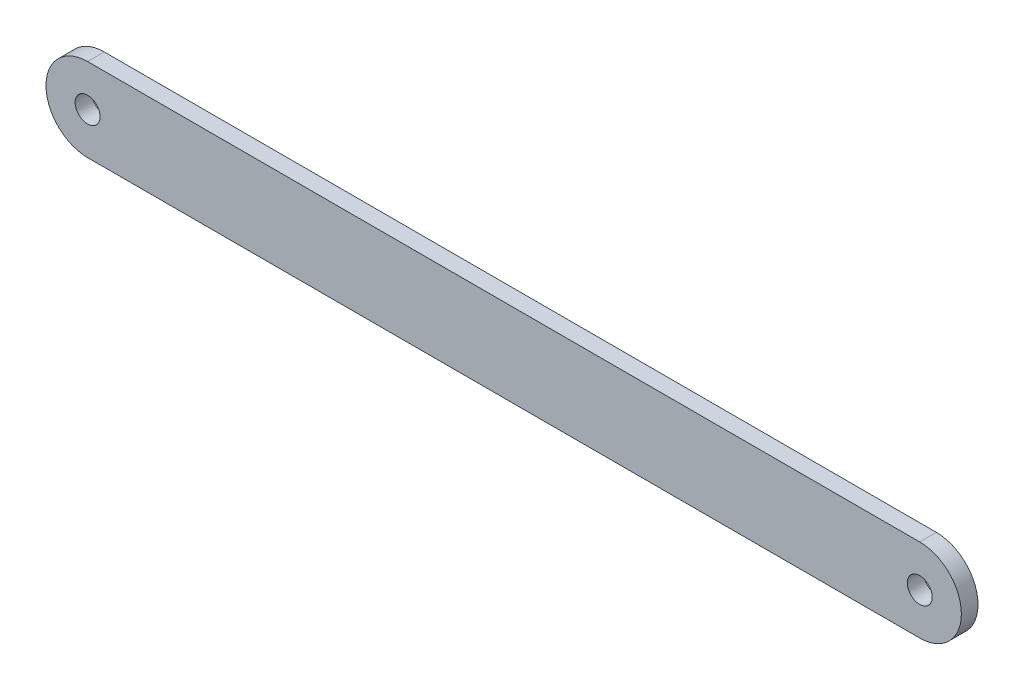
ISO-10303-21;
HEADER;
FILE_DESCRIPTION(('STEP AP214'),'2;1');
FILE_NAME('part.step','',(''),(''),'','','');
FILE_SCHEMA(('AUTOMOTIVE_DESIGN { 1 0 10303 214 1 1 1 1 }'));
ENDSEC;
DATA;
#1=APPLICATION_CONTEXT('core data for automotive mechanical design processes');
#2=APPLICATION_PROTOCOL_DEFINITION('international standard','automotive_design',2000,#1);
#3=PRODUCT_CONTEXT('',#1,'mechanical');
#4=PRODUCT('Part','Part','',(#3));
#5=PRODUCT_RELATED_PRODUCT_CATEGORY('part','',(#4));
#6=PRODUCT_DEFINITION_FORMATION('','',#4);
#7=PRODUCT_DEFINITION_CONTEXT('part definition',#1,'design');
#8=PRODUCT_DEFINITION('design','',#6,#7);
#9=PRODUCT_DEFINITION_SHAPE('','',#8);
#10=(LENGTH_UNIT() NAMED_UNIT(*) SI_UNIT(.MILLI.,.METRE.));
#11=(NAMED_UNIT(*) PLANE_ANGLE_UNIT() SI_UNIT($,.RADIAN.));
#12=(NAMED_UNIT(*) SI_UNIT($,.STERADIAN.) SOLID_ANGLE_UNIT());
#13=UNCERTAINTY_MEASURE_WITH_UNIT(LENGTH_MEASURE(1.E-05),#10,'distance_accuracy_value','');
#14=(GEOMETRIC_REPRESENTATION_CONTEXT(3) GLOBAL_UNCERTAINTY_ASSIGNED_CONTEXT((#13)) GLOBAL_UNIT_ASSIGNED_CONTEXT((#10,
#11,#12)) REPRESENTATION_CONTEXT('',''));
#15=CARTESIAN_POINT('',(0.,0.,0.));
#16=DIRECTION('',(0.,0.,1.));
#17=DIRECTION('',(1.,0.,0.));
#18=AXIS2_PLACEMENT_3D('',#15,#16,#17);
#19=CARTESIAN_POINT('',(50.,0.,2.));
#20=DIRECTION('',(0.,0.,1.));
#21=DIRECTION('',(1.,0.,0.));
#22=AXIS2_PLACEMENT_3D('',#19,#20,#21);
#23=PLANE('',#22);
#24=CARTESIAN_POINT('',(0.,0.,2.));
#25=DIRECTION('',(0.,0.,1.));
#26=DIRECTION('',(1.,0.,0.));
#27=AXIS2_PLACEMENT_3D('',#24,#25,#26);
#28=CIRCLE('',#27,1.5);
#29=CARTESIAN_POINT('',(1.5,0.,2.));
#30=VERTEX_POINT('',#29);
#31=EDGE_CURVE('E25',#30,#30,#28,.T.);
#32=ORIENTED_EDGE('',*,*,#31,.F.);
#33=EDGE_LOOP('',(#32));
#34=FACE_BOUND('',#33,.T.);
#35=CARTESIAN_POINT('',(100.,0.,2.));
#36=DIRECTION('',(0.,0.,1.));
#37=DIRECTION('',(1.,0.,0.));
#38=AXIS2_PLACEMENT_3D('',#35,#36,#37);
#39=CIRCLE('',#38,1.5);
#40=CARTESIAN_POINT('',(101.5,0.,2.));
#41=VERTEX_POINT('',#40);
#42=EDGE_CURVE('E113',#41,#41,#39,.T.);
#43=ORIENTED_EDGE('',*,*,#42,.F.);
#44=EDGE_LOOP('',(#43));
#45=FACE_BOUND('',#44,.T.);
#46=CARTESIAN_POINT('',(0.,0.,2.));
#47=DIRECTION('',(0.,0.,1.));
#48=DIRECTION('',(1.,0.,0.));
#49=AXIS2_PLACEMENT_3D('',#46,#47,#48);
#50=CIRCLE('',#49,5.);
#51=CARTESIAN_POINT('',(0.,5.,2.));
#52=VERTEX_POINT('',#51);
#53=CARTESIAN_POINT('',(0.,-5.,2.));
#54=VERTEX_POINT('',#53);
#55=EDGE_CURVE('E126',#52,#54,#50,.T.);
#56=ORIENTED_EDGE('',*,*,#55,.T.);
#57=DIRECTION('',(1.,0.,0.));
#58=VECTOR('',#57,1.);
#59=CARTESIAN_POINT('',(0.,-5.,2.));
#60=LINE('',#59,#58);
#61=CARTESIAN_POINT('',(100.,-5.,2.));
#62=VERTEX_POINT('',#61);
#63=EDGE_CURVE('E92',#54,#62,#60,.T.);
#64=ORIENTED_EDGE('',*,*,#63,.T.);
#65=CARTESIAN_POINT('',(100.,0.,2.));
#66=DIRECTION('',(0.,0.,1.));
#67=DIRECTION('',(1.,0.,0.));
#68=AXIS2_PLACEMENT_3D('',#65,#66,#67);
#69=CIRCLE('',#68,5.);
#70=CARTESIAN_POINT('',(100.,5.,2.));
#71=VERTEX_POINT('',#70);
#72=EDGE_CURVE('E91',#62,#71,#69,.T.);
#73=ORIENTED_EDGE('',*,*,#72,.T.);
#74=DIRECTION('',(-1.,0.,0.));
#75=VECTOR('',#74,1.);
#76=CARTESIAN_POINT('',(100.,5.,2.));
#77=LINE('',#76,#75);
#78=EDGE_CURVE('E73',#71,#52,#77,.T.);
#79=ORIENTED_EDGE('',*,*,#78,.T.);
#80=EDGE_LOOP('',(#56,#64,#73,#79));
#81=FACE_BOUND('',#80,.T.);
#82=ADVANCED_FACE('F14',(#34,#45,#81),#23,.T.);
#83=CARTESIAN_POINT('',(50.,0.,0.));
#84=DIRECTION('',(0.,0.,1.));
#85=DIRECTION('',(1.,0.,0.));
#86=AXIS2_PLACEMENT_3D('',#83,#84,#85);
#87=PLANE('',#86);
#88=CARTESIAN_POINT('',(0.,0.,0.));
#89=DIRECTION('',(0.,0.,1.));
#90=DIRECTION('',(1.,0.,0.));
#91=AXIS2_PLACEMENT_3D('',#88,#89,#90);
#92=CIRCLE('',#91,1.5);
#93=CARTESIAN_POINT('',(1.5,0.,0.));
#94=VERTEX_POINT('',#93);
#95=EDGE_CURVE('E9',#94,#94,#92,.T.);
#96=ORIENTED_EDGE('',*,*,#95,.T.);
#97=EDGE_LOOP('',(#96));
#98=FACE_BOUND('',#97,.T.);
#99=CARTESIAN_POINT('',(100.,0.,0.));
#100=DIRECTION('',(0.,0.,1.));
#101=DIRECTION('',(1.,0.,0.));
#102=AXIS2_PLACEMENT_3D('',#99,#100,#101);
#103=CIRCLE('',#102,1.5);
#104=CARTESIAN_POINT('',(101.5,0.,0.));
#105=VERTEX_POINT('',#104);
#106=EDGE_CURVE('E115',#105,#105,#103,.T.);
#107=ORIENTED_EDGE('',*,*,#106,.T.);
#108=EDGE_LOOP('',(#107));
#109=FACE_BOUND('',#108,.T.);
#110=DIRECTION('',(-1.,0.,0.));
#111=VECTOR('',#110,1.);
#112=CARTESIAN_POINT('',(100.,5.,0.));
#113=LINE('',#112,#111);
#114=CARTESIAN_POINT('',(100.,5.,0.));
#115=VERTEX_POINT('',#114);
#116=CARTESIAN_POINT('',(0.,5.,0.));
#117=VERTEX_POINT('',#116);
#118=EDGE_CURVE('E87',#115,#117,#113,.T.);
#119=ORIENTED_EDGE('',*,*,#118,.F.);
#120=CARTESIAN_POINT('',(100.,0.,0.));
#121=DIRECTION('',(0.,0.,1.));
#122=DIRECTION('',(1.,0.,0.));
#123=AXIS2_PLACEMENT_3D('',#120,#121,#122);
#124=CIRCLE('',#123,5.);
#125=CARTESIAN_POINT('',(100.,-5.,0.));
#126=VERTEX_POINT('',#125);
#127=EDGE_CURVE('E99',#126,#115,#124,.T.);
#128=ORIENTED_EDGE('',*,*,#127,.F.);
#129=DIRECTION('',(1.,0.,0.));
#130=VECTOR('',#129,1.);
#131=CARTESIAN_POINT('',(0.,-5.,0.));
#132=LINE('',#131,#130);
#133=CARTESIAN_POINT('',(0.,-5.,0.));
#134=VERTEX_POINT('',#133);
#135=EDGE_CURVE('E158',#134,#126,#132,.T.);
#136=ORIENTED_EDGE('',*,*,#135,.F.);
#137=CARTESIAN_POINT('',(0.,0.,0.));
#138=DIRECTION('',(0.,0.,1.));
#139=DIRECTION('',(1.,0.,0.));
#140=AXIS2_PLACEMENT_3D('',#137,#138,#139);
#141=CIRCLE('',#140,5.);
#142=EDGE_CURVE('E116',#117,#134,#141,.T.);
#143=ORIENTED_EDGE('',*,*,#142,.F.);
#144=EDGE_LOOP('',(#119,#128,#136,#143));
#145=FACE_BOUND('',#144,.T.);
#146=ADVANCED_FACE('F148',(#98,#109,#145),#87,.F.);
#147=CARTESIAN_POINT('',(0.,0.,0.));
#148=DIRECTION('',(0.,0.,-1.));
#149=DIRECTION('',(1.,0.,0.));
#150=AXIS2_PLACEMENT_3D('',#147,#148,#149);
#151=CYLINDRICAL_SURFACE('',#150,1.5);
#152=DIRECTION('',(0.,0.,1.));
#153=VECTOR('',#152,1.);
#154=CARTESIAN_POINT('',(1.5,0.,0.));
#155=LINE('',#154,#153);
#156=EDGE_CURVE('E18',#94,#30,#155,.T.);
#157=ORIENTED_EDGE('',*,*,#156,.T.);
#158=ORIENTED_EDGE('',*,*,#31,.T.);
#159=ORIENTED_EDGE('',*,*,#156,.F.);
#160=ORIENTED_EDGE('',*,*,#95,.F.);
#161=EDGE_LOOP('',(#157,#158,#159,#160));
#162=FACE_BOUND('',#161,.T.);
#163=ADVANCED_FACE('F146',(#162),#151,.F.);
#164=CARTESIAN_POINT('',(100.,0.,0.));
#165=DIRECTION('',(0.,0.,-1.));
#166=DIRECTION('',(1.,0.,0.));
#167=AXIS2_PLACEMENT_3D('',#164,#165,#166);
#168=CYLINDRICAL_SURFACE('',#167,1.5);
#169=DIRECTION('',(0.,0.,1.));
#170=VECTOR('',#169,1.);
#171=CARTESIAN_POINT('',(101.5,0.,0.));
#172=LINE('',#171,#170);
#173=EDGE_CURVE('E86',#105,#41,#172,.T.);
#174=ORIENTED_EDGE('',*,*,#173,.T.);
#175=ORIENTED_EDGE('',*,*,#42,.T.);
#176=ORIENTED_EDGE('',*,*,#173,.F.);
#177=ORIENTED_EDGE('',*,*,#106,.F.);
#178=EDGE_LOOP('',(#174,#175,#176,#177));
#179=FACE_BOUND('',#178,.T.);
#180=ADVANCED_FACE('F16',(#179),#168,.F.);
#181=CARTESIAN_POINT('',(100.,5.,0.));
#182=DIRECTION('',(0.,-1.,0.));
#183=DIRECTION('',(0.,0.,-1.));
#184=AXIS2_PLACEMENT_3D('',#181,#182,#183);
#185=PLANE('',#184);
#186=ORIENTED_EDGE('',*,*,#118,.T.);
#187=DIRECTION('',(0.,0.,1.));
#188=VECTOR('',#187,1.);
#189=CARTESIAN_POINT('',(0.,5.,0.));
#190=LINE('',#189,#188);
#191=EDGE_CURVE('E81',#117,#52,#190,.T.);
#192=ORIENTED_EDGE('',*,*,#191,.T.);
#193=ORIENTED_EDGE('',*,*,#78,.F.);
#194=DIRECTION('',(0.,0.,1.));
#195=VECTOR('',#194,1.);
#196=CARTESIAN_POINT('',(100.,5.,0.));
#197=LINE('',#196,#195);
#198=EDGE_CURVE('E78',#115,#71,#197,.T.);
#199=ORIENTED_EDGE('',*,*,#198,.F.);
#200=EDGE_LOOP('',(#186,#192,#193,#199));
#201=FACE_BOUND('',#200,.T.);
#202=ADVANCED_FACE('F76',(#201),#185,.F.);
#203=CARTESIAN_POINT('',(100.,0.,0.));
#204=DIRECTION('',(0.,0.,-1.));
#205=DIRECTION('',(1.,0.,0.));
#206=AXIS2_PLACEMENT_3D('',#203,#204,#205);
#207=CYLINDRICAL_SURFACE('',#206,5.);
#208=ORIENTED_EDGE('',*,*,#127,.T.);
#209=ORIENTED_EDGE('',*,*,#198,.T.);
#210=ORIENTED_EDGE('',*,*,#72,.F.);
#211=DIRECTION('',(0.,0.,1.));
#212=VECTOR('',#211,1.);
#213=CARTESIAN_POINT('',(100.,-5.,0.));
#214=LINE('',#213,#212);
#215=EDGE_CURVE('E111',#126,#62,#214,.T.);
#216=ORIENTED_EDGE('',*,*,#215,.F.);
#217=EDGE_LOOP('',(#208,#209,#210,#216));
#218=FACE_BOUND('',#217,.T.);
#219=ADVANCED_FACE('F98',(#218),#207,.T.);
#220=CARTESIAN_POINT('',(0.,-5.,0.));
#221=DIRECTION('',(0.,1.,0.));
#222=DIRECTION('',(1.,0.,0.));
#223=AXIS2_PLACEMENT_3D('',#220,#221,#222);
#224=PLANE('',#223);
#225=ORIENTED_EDGE('',*,*,#135,.T.);
#226=ORIENTED_EDGE('',*,*,#215,.T.);
#227=ORIENTED_EDGE('',*,*,#63,.F.);
#228=DIRECTION('',(0.,0.,1.));
#229=VECTOR('',#228,1.);
#230=CARTESIAN_POINT('',(0.,-5.,0.));
#231=LINE('',#230,#229);
#232=EDGE_CURVE('E119',#134,#54,#231,.T.);
#233=ORIENTED_EDGE('',*,*,#232,.F.);
#234=EDGE_LOOP('',(#225,#226,#227,#233));
#235=FACE_BOUND('',#234,.T.);
#236=ADVANCED_FACE('F224',(#235),#224,.F.);
#237=CARTESIAN_POINT('',(0.,0.,0.));
#238=DIRECTION('',(0.,0.,-1.));
#239=DIRECTION('',(1.,0.,0.));
#240=AXIS2_PLACEMENT_3D('',#237,#238,#239);
#241=CYLINDRICAL_SURFACE('',#240,5.);
#242=ORIENTED_EDGE('',*,*,#142,.T.);
#243=ORIENTED_EDGE('',*,*,#232,.T.);
#244=ORIENTED_EDGE('',*,*,#55,.F.);
#245=ORIENTED_EDGE('',*,*,#191,.F.);
#246=EDGE_LOOP('',(#242,#243,#244,#245));
#247=FACE_BOUND('',#246,.T.);
#248=ADVANCED_FACE('F232',(#247),#241,.T.);
#249=CLOSED_SHELL('',(#82,#146,#163,#180,#202,#219,#236,#248));
#250=MANIFOLD_SOLID_BREP('B1',#249);
#251=ADVANCED_BREP_SHAPE_REPRESENTATION('',(#18,#250),#14);
#252=SHAPE_DEFINITION_REPRESENTATION(#9,#251);
ENDSEC;
END-ISO-10303-21;
